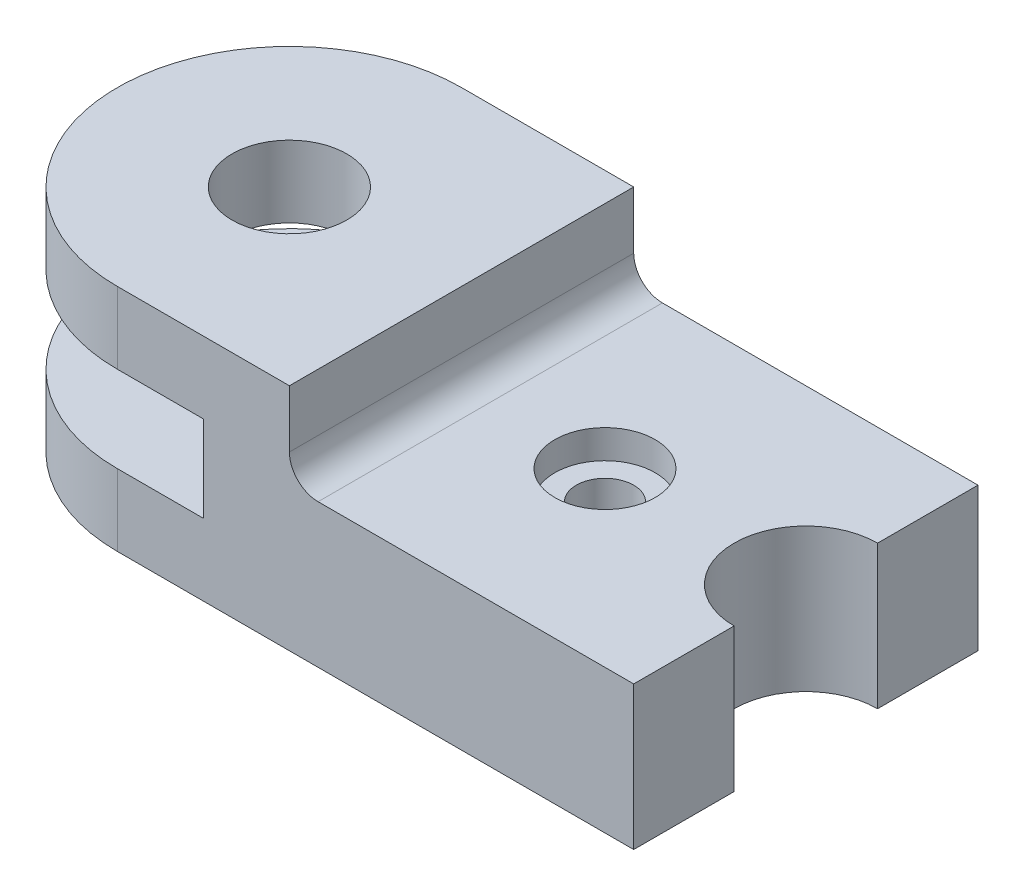
ISO-10303-21;
HEADER;
FILE_DESCRIPTION(('STEP AP214'),'2;1');
FILE_NAME('part.step','',(''),(''),'','','');
FILE_SCHEMA(('AUTOMOTIVE_DESIGN { 1 0 10303 214 1 1 1 1 }'));
ENDSEC;
DATA;
#1=APPLICATION_CONTEXT('core data for automotive mechanical design processes');
#2=APPLICATION_PROTOCOL_DEFINITION('international standard','automotive_design',2000,#1);
#3=PRODUCT_CONTEXT('',#1,'mechanical');
#4=PRODUCT('Part','Part','',(#3));
#5=PRODUCT_RELATED_PRODUCT_CATEGORY('part','',(#4));
#6=PRODUCT_DEFINITION_FORMATION('','',#4);
#7=PRODUCT_DEFINITION_CONTEXT('part definition',#1,'design');
#8=PRODUCT_DEFINITION('design','',#6,#7);
#9=PRODUCT_DEFINITION_SHAPE('','',#8);
#10=(LENGTH_UNIT() NAMED_UNIT(*) SI_UNIT(.MILLI.,.METRE.));
#11=(NAMED_UNIT(*) PLANE_ANGLE_UNIT() SI_UNIT($,.RADIAN.));
#12=(NAMED_UNIT(*) SI_UNIT($,.STERADIAN.) SOLID_ANGLE_UNIT());
#13=UNCERTAINTY_MEASURE_WITH_UNIT(LENGTH_MEASURE(1.E-05),#10,'distance_accuracy_value','');
#14=(GEOMETRIC_REPRESENTATION_CONTEXT(3) GLOBAL_UNCERTAINTY_ASSIGNED_CONTEXT((#13)) GLOBAL_UNIT_ASSIGNED_CONTEXT((#10,
#11,#12)) REPRESENTATION_CONTEXT('',''));
#15=CARTESIAN_POINT('',(0.,0.,0.));
#16=DIRECTION('',(0.,0.,1.));
#17=DIRECTION('',(1.,0.,0.));
#18=AXIS2_PLACEMENT_3D('',#15,#16,#17);
#19=CARTESIAN_POINT('',(69.85,0.,0.));
#20=DIRECTION('',(0.,1.,0.));
#21=DIRECTION('',(0.,0.,1.));
#22=AXIS2_PLACEMENT_3D('',#19,#20,#21);
#23=CYLINDRICAL_SURFACE('',#22,6.35);
#24=CARTESIAN_POINT('',(69.85,0.,0.));
#25=DIRECTION('',(0.,1.,0.));
#26=DIRECTION('',(0.,0.,1.));
#27=AXIS2_PLACEMENT_3D('',#24,#25,#26);
#28=CIRCLE('',#27,6.35);
#29=CARTESIAN_POINT('',(69.85,0.,6.34999999999998));
#30=VERTEX_POINT('',#29);
#31=EDGE_CURVE('E160',#30,#30,#28,.T.);
#32=ORIENTED_EDGE('',*,*,#31,.F.);
#33=EDGE_LOOP('',(#32));
#34=FACE_BOUND('',#33,.T.);
#35=CARTESIAN_POINT('',(69.85,25.4,0.));
#36=DIRECTION('',(0.,1.,0.));
#37=DIRECTION('',(0.,0.,1.));
#38=AXIS2_PLACEMENT_3D('',#35,#36,#37);
#39=CIRCLE('',#38,6.35);
#40=CARTESIAN_POINT('',(69.85,25.4,6.34999999999998));
#41=VERTEX_POINT('',#40);
#42=EDGE_CURVE('E53',#41,#41,#39,.F.);
#43=ORIENTED_EDGE('',*,*,#42,.F.);
#44=EDGE_LOOP('',(#43));
#45=FACE_BOUND('',#44,.T.);
#46=ADVANCED_FACE('F49',(#34,#45),#23,.F.);
#47=CARTESIAN_POINT('',(114.3,50.8,38.1));
#48=DIRECTION('',(-1.,0.,0.));
#49=DIRECTION('',(0.,0.,1.));
#50=AXIS2_PLACEMENT_3D('',#47,#48,#49);
#51=PLANE('',#50);
#52=DIRECTION('',(0.,0.,-1.));
#53=VECTOR('',#52,1.);
#54=CARTESIAN_POINT('',(114.3,0.,38.1));
#55=LINE('',#54,#53);
#56=CARTESIAN_POINT('',(114.3,0.,38.1));
#57=VERTEX_POINT('',#56);
#58=CARTESIAN_POINT('',(114.3,0.,15.875));
#59=VERTEX_POINT('',#58);
#60=EDGE_CURVE('E157',#57,#59,#55,.T.);
#61=ORIENTED_EDGE('',*,*,#60,.T.);
#62=DIRECTION('',(0.,1.,0.));
#63=VECTOR('',#62,1.);
#64=CARTESIAN_POINT('',(114.3,0.,15.875));
#65=LINE('',#64,#63);
#66=CARTESIAN_POINT('',(114.3,31.75,15.875));
#67=VERTEX_POINT('',#66);
#68=EDGE_CURVE('E142',#59,#67,#65,.T.);
#69=ORIENTED_EDGE('',*,*,#68,.T.);
#70=DIRECTION('',(0.,0.,-1.));
#71=VECTOR('',#70,1.);
#72=CARTESIAN_POINT('',(114.3,31.75,260.35));
#73=LINE('',#72,#71);
#74=CARTESIAN_POINT('',(114.3,31.75,38.1));
#75=VERTEX_POINT('',#74);
#76=EDGE_CURVE('E241',#75,#67,#73,.T.);
#77=ORIENTED_EDGE('',*,*,#76,.F.);
#78=DIRECTION('',(0.,-1.,0.));
#79=VECTOR('',#78,1.);
#80=CARTESIAN_POINT('',(114.3,50.8,38.1));
#81=LINE('',#80,#79);
#82=EDGE_CURVE('E164',#75,#57,#81,.T.);
#83=ORIENTED_EDGE('',*,*,#82,.T.);
#84=EDGE_LOOP('',(#61,#69,#77,#83));
#85=FACE_BOUND('',#84,.T.);
#86=ADVANCED_FACE('F162',(#85),#51,.F.);
#87=CARTESIAN_POINT('',(0.,50.8,38.1));
#88=DIRECTION('',(0.,0.,-1.));
#89=DIRECTION('',(-1.,0.,0.));
#90=AXIS2_PLACEMENT_3D('',#87,#88,#89);
#91=PLANE('',#90);
#92=DIRECTION('',(-1.,0.,0.));
#93=VECTOR('',#92,1.);
#94=CARTESIAN_POINT('',(0.,15.875,38.1));
#95=LINE('',#94,#93);
#96=CARTESIAN_POINT('',(19.05,15.875,38.1));
#97=VERTEX_POINT('',#96);
#98=CARTESIAN_POINT('',(0.,15.875,38.1));
#99=VERTEX_POINT('',#98);
#100=EDGE_CURVE('E225',#97,#99,#95,.T.);
#101=ORIENTED_EDGE('',*,*,#100,.T.);
#102=DIRECTION('',(0.,-1.,0.));
#103=VECTOR('',#102,1.);
#104=CARTESIAN_POINT('',(0.,50.8,38.1));
#105=LINE('',#104,#103);
#106=CARTESIAN_POINT('',(0.,0.,38.1));
#107=VERTEX_POINT('',#106);
#108=EDGE_CURVE('E183',#99,#107,#105,.T.);
#109=ORIENTED_EDGE('',*,*,#108,.T.);
#110=DIRECTION('',(1.,0.,0.));
#111=VECTOR('',#110,1.);
#112=CARTESIAN_POINT('',(0.,0.,38.1));
#113=LINE('',#112,#111);
#114=EDGE_CURVE('E171',#107,#57,#113,.T.);
#115=ORIENTED_EDGE('',*,*,#114,.T.);
#116=ORIENTED_EDGE('',*,*,#82,.F.);
#117=DIRECTION('',(1.,0.,0.));
#118=VECTOR('',#117,1.);
#119=CARTESIAN_POINT('',(0.,31.75,38.1));
#120=LINE('',#119,#118);
#121=CARTESIAN_POINT('',(44.45,31.75,38.1));
#122=VERTEX_POINT('',#121);
#123=EDGE_CURVE('E248',#122,#75,#120,.T.);
#124=ORIENTED_EDGE('',*,*,#123,.F.);
#125=CARTESIAN_POINT('',(44.45,38.1,38.1));
#126=DIRECTION('',(0.,0.,-1.));
#127=DIRECTION('',(-1.,0.,0.));
#128=AXIS2_PLACEMENT_3D('',#125,#126,#127);
#129=CIRCLE('',#128,6.35);
#130=CARTESIAN_POINT('',(38.1,38.1,38.1));
#131=VERTEX_POINT('',#130);
#132=EDGE_CURVE('E200',#122,#131,#129,.T.);
#133=ORIENTED_EDGE('',*,*,#132,.T.);
#134=DIRECTION('',(0.,-1.,0.));
#135=VECTOR('',#134,1.);
#136=CARTESIAN_POINT('',(38.1,50.8,38.1));
#137=LINE('',#136,#135);
#138=CARTESIAN_POINT('',(38.1,50.8,38.1));
#139=VERTEX_POINT('',#138);
#140=EDGE_CURVE('E245',#139,#131,#137,.T.);
#141=ORIENTED_EDGE('',*,*,#140,.F.);
#142=DIRECTION('',(1.,0.,0.));
#143=VECTOR('',#142,1.);
#144=CARTESIAN_POINT('',(0.,50.8,38.1));
#145=LINE('',#144,#143);
#146=CARTESIAN_POINT('',(0.,50.8,38.1));
#147=VERTEX_POINT('',#146);
#148=EDGE_CURVE('E253',#147,#139,#145,.T.);
#149=ORIENTED_EDGE('',*,*,#148,.F.);
#150=CARTESIAN_POINT('',(0.,34.925,38.1));
#151=VERTEX_POINT('',#150);
#152=EDGE_CURVE('E184',#147,#151,#105,.T.);
#153=ORIENTED_EDGE('',*,*,#152,.T.);
#154=DIRECTION('',(-1.,0.,0.));
#155=VECTOR('',#154,1.);
#156=CARTESIAN_POINT('',(0.,34.925,38.1));
#157=LINE('',#156,#155);
#158=CARTESIAN_POINT('',(19.05,34.925,38.1));
#159=VERTEX_POINT('',#158);
#160=EDGE_CURVE('E72',#159,#151,#157,.T.);
#161=ORIENTED_EDGE('',*,*,#160,.F.);
#162=DIRECTION('',(0.,-1.,0.));
#163=VECTOR('',#162,1.);
#164=CARTESIAN_POINT('',(19.05,0.,38.1));
#165=LINE('',#164,#163);
#166=EDGE_CURVE('E212',#159,#97,#165,.T.);
#167=ORIENTED_EDGE('',*,*,#166,.T.);
#168=EDGE_LOOP('',(#101,#109,#115,#116,#124,#133,#141,#149,#153,#161,#167));
#169=FACE_BOUND('',#168,.T.);
#170=ADVANCED_FACE('F262',(#169),#91,.F.);
#171=CARTESIAN_POINT('',(114.3,50.8,-38.1));
#172=DIRECTION('',(0.,0.,1.));
#173=DIRECTION('',(1.,0.,0.));
#174=AXIS2_PLACEMENT_3D('',#171,#172,#173);
#175=PLANE('',#174);
#176=DIRECTION('',(-1.,0.,0.));
#177=VECTOR('',#176,1.);
#178=CARTESIAN_POINT('',(0.,15.875,-38.1));
#179=LINE('',#178,#177);
#180=CARTESIAN_POINT('',(19.05,15.875,-38.1));
#181=VERTEX_POINT('',#180);
#182=CARTESIAN_POINT('',(0.,15.875,-38.1));
#183=VERTEX_POINT('',#182);
#184=EDGE_CURVE('E228',#181,#183,#179,.T.);
#185=ORIENTED_EDGE('',*,*,#184,.F.);
#186=DIRECTION('',(0.,-1.,0.));
#187=VECTOR('',#186,1.);
#188=CARTESIAN_POINT('',(19.05,0.,-38.1));
#189=LINE('',#188,#187);
#190=CARTESIAN_POINT('',(19.05,34.925,-38.1));
#191=VERTEX_POINT('',#190);
#192=EDGE_CURVE('E222',#191,#181,#189,.T.);
#193=ORIENTED_EDGE('',*,*,#192,.F.);
#194=DIRECTION('',(-1.,0.,0.));
#195=VECTOR('',#194,1.);
#196=CARTESIAN_POINT('',(0.,34.925,-38.1));
#197=LINE('',#196,#195);
#198=CARTESIAN_POINT('',(0.,34.925,-38.1));
#199=VERTEX_POINT('',#198);
#200=EDGE_CURVE('E224',#191,#199,#197,.T.);
#201=ORIENTED_EDGE('',*,*,#200,.T.);
#202=DIRECTION('',(0.,-1.,0.));
#203=VECTOR('',#202,1.);
#204=CARTESIAN_POINT('',(0.,50.8,-38.1));
#205=LINE('',#204,#203);
#206=CARTESIAN_POINT('',(0.,50.8,-38.1));
#207=VERTEX_POINT('',#206);
#208=EDGE_CURVE('E175',#207,#199,#205,.T.);
#209=ORIENTED_EDGE('',*,*,#208,.F.);
#210=DIRECTION('',(-1.,0.,0.));
#211=VECTOR('',#210,1.);
#212=CARTESIAN_POINT('',(114.3,50.8,-38.1));
#213=LINE('',#212,#211);
#214=CARTESIAN_POINT('',(38.1,50.8,-38.1));
#215=VERTEX_POINT('',#214);
#216=EDGE_CURVE('E256',#215,#207,#213,.T.);
#217=ORIENTED_EDGE('',*,*,#216,.F.);
#218=DIRECTION('',(0.,1.,0.));
#219=VECTOR('',#218,1.);
#220=CARTESIAN_POINT('',(38.1,50.8,-38.1));
#221=LINE('',#220,#219);
#222=CARTESIAN_POINT('',(38.1,38.1,-38.1));
#223=VERTEX_POINT('',#222);
#224=EDGE_CURVE('E243',#223,#215,#221,.T.);
#225=ORIENTED_EDGE('',*,*,#224,.F.);
#226=CARTESIAN_POINT('',(44.45,38.1,-38.1));
#227=DIRECTION('',(0.,0.,1.));
#228=DIRECTION('',(1.,0.,0.));
#229=AXIS2_PLACEMENT_3D('',#226,#227,#228);
#230=CIRCLE('',#229,6.35);
#231=CARTESIAN_POINT('',(44.45,31.75,-38.1));
#232=VERTEX_POINT('',#231);
#233=EDGE_CURVE('E198',#223,#232,#230,.T.);
#234=ORIENTED_EDGE('',*,*,#233,.T.);
#235=DIRECTION('',(-1.,0.,0.));
#236=VECTOR('',#235,1.);
#237=CARTESIAN_POINT('',(114.3,31.75,-38.1));
#238=LINE('',#237,#236);
#239=CARTESIAN_POINT('',(114.3,31.75,-38.1));
#240=VERTEX_POINT('',#239);
#241=EDGE_CURVE('E190',#240,#232,#238,.T.);
#242=ORIENTED_EDGE('',*,*,#241,.F.);
#243=DIRECTION('',(0.,-1.,0.));
#244=VECTOR('',#243,1.);
#245=CARTESIAN_POINT('',(114.3,50.8,-38.1));
#246=LINE('',#245,#244);
#247=CARTESIAN_POINT('',(114.3,0.,-38.1));
#248=VERTEX_POINT('',#247);
#249=EDGE_CURVE('E178',#240,#248,#246,.T.);
#250=ORIENTED_EDGE('',*,*,#249,.T.);
#251=DIRECTION('',(-1.,0.,0.));
#252=VECTOR('',#251,1.);
#253=CARTESIAN_POINT('',(114.3,0.,-38.1));
#254=LINE('',#253,#252);
#255=CARTESIAN_POINT('',(0.,0.,-38.1));
#256=VERTEX_POINT('',#255);
#257=EDGE_CURVE('E166',#248,#256,#254,.T.);
#258=ORIENTED_EDGE('',*,*,#257,.T.);
#259=EDGE_CURVE('E179',#183,#256,#205,.T.);
#260=ORIENTED_EDGE('',*,*,#259,.F.);
#261=EDGE_LOOP('',(#185,#193,#201,#209,#217,#225,#234,#242,#250,#258,#260));
#262=FACE_BOUND('',#261,.T.);
#263=ADVANCED_FACE('F267',(#262),#175,.F.);
#264=CARTESIAN_POINT('',(0.,50.8,0.));
#265=DIRECTION('',(0.,-1.,0.));
#266=DIRECTION('',(0.,0.,-1.));
#267=AXIS2_PLACEMENT_3D('',#264,#265,#266);
#268=CYLINDRICAL_SURFACE('',#267,38.1);
#269=CARTESIAN_POINT('',(0.,15.875,0.));
#270=DIRECTION('',(0.,1.,0.));
#271=DIRECTION('',(-1.,0.,0.));
#272=AXIS2_PLACEMENT_3D('',#269,#270,#271);
#273=CIRCLE('',#272,38.1);
#274=EDGE_CURVE('E58',#183,#99,#273,.T.);
#275=ORIENTED_EDGE('',*,*,#274,.F.);
#276=ORIENTED_EDGE('',*,*,#259,.T.);
#277=CARTESIAN_POINT('',(0.,0.,0.));
#278=DIRECTION('',(0.,1.,0.));
#279=DIRECTION('',(0.,0.,1.));
#280=AXIS2_PLACEMENT_3D('',#277,#278,#279);
#281=CIRCLE('',#280,38.1);
#282=EDGE_CURVE('E250',#256,#107,#281,.T.);
#283=ORIENTED_EDGE('',*,*,#282,.T.);
#284=ORIENTED_EDGE('',*,*,#108,.F.);
#285=EDGE_LOOP('',(#275,#276,#283,#284));
#286=FACE_BOUND('',#285,.T.);
#287=ADVANCED_FACE('F332',(#286),#268,.T.);
#288=CARTESIAN_POINT('',(114.3,31.75,-15.875));
#289=VERTEX_POINT('',#288);
#290=EDGE_CURVE('E239',#289,#240,#73,.T.);
#291=ORIENTED_EDGE('',*,*,#290,.F.);
#292=DIRECTION('',(0.,1.,0.));
#293=VECTOR('',#292,1.);
#294=CARTESIAN_POINT('',(114.3,0.,-15.875));
#295=LINE('',#294,#293);
#296=CARTESIAN_POINT('',(114.3,0.,-15.875));
#297=VERTEX_POINT('',#296);
#298=EDGE_CURVE('E64',#289,#297,#295,.F.);
#299=ORIENTED_EDGE('',*,*,#298,.T.);
#300=EDGE_CURVE('E159',#297,#248,#55,.T.);
#301=ORIENTED_EDGE('',*,*,#300,.T.);
#302=ORIENTED_EDGE('',*,*,#249,.F.);
#303=EDGE_LOOP('',(#291,#299,#301,#302));
#304=FACE_BOUND('',#303,.T.);
#305=ADVANCED_FACE('F272',(#304),#51,.F.);
#306=CARTESIAN_POINT('',(0.,50.8,0.));
#307=DIRECTION('',(0.,1.,0.));
#308=DIRECTION('',(0.,0.,1.));
#309=AXIS2_PLACEMENT_3D('',#306,#307,#308);
#310=PLANE('',#309);
#311=CARTESIAN_POINT('',(0.,50.8,0.));
#312=DIRECTION('',(0.,1.,0.));
#313=DIRECTION('',(0.,0.,1.));
#314=AXIS2_PLACEMENT_3D('',#311,#312,#313);
#315=CIRCLE('',#314,12.7);
#316=CARTESIAN_POINT('',(0.,50.8,12.7));
#317=VERTEX_POINT('',#316);
#318=EDGE_CURVE('E150',#317,#317,#315,.T.);
#319=ORIENTED_EDGE('',*,*,#318,.F.);
#320=EDGE_LOOP('',(#319));
#321=FACE_BOUND('',#320,.T.);
#322=ORIENTED_EDGE('',*,*,#148,.T.);
#323=DIRECTION('',(0.,0.,-1.));
#324=VECTOR('',#323,1.);
#325=CARTESIAN_POINT('',(38.1,50.8,0.));
#326=LINE('',#325,#324);
#327=EDGE_CURVE('E187',#139,#215,#326,.T.);
#328=ORIENTED_EDGE('',*,*,#327,.T.);
#329=ORIENTED_EDGE('',*,*,#216,.T.);
#330=CARTESIAN_POINT('',(0.,50.8,0.));
#331=DIRECTION('',(0.,1.,0.));
#332=DIRECTION('',(0.,0.,1.));
#333=AXIS2_PLACEMENT_3D('',#330,#331,#332);
#334=CIRCLE('',#333,38.1);
#335=EDGE_CURVE('E169',#207,#147,#334,.T.);
#336=ORIENTED_EDGE('',*,*,#335,.T.);
#337=EDGE_LOOP('',(#322,#328,#329,#336));
#338=FACE_BOUND('',#337,.T.);
#339=ADVANCED_FACE('F323',(#321,#338),#310,.T.);
#340=ORIENTED_EDGE('',*,*,#208,.T.);
#341=CARTESIAN_POINT('',(0.,34.925,0.));
#342=DIRECTION('',(0.,1.,0.));
#343=DIRECTION('',(0.,0.,1.));
#344=AXIS2_PLACEMENT_3D('',#341,#342,#343);
#345=CIRCLE('',#344,38.1);
#346=EDGE_CURVE('E202',#199,#151,#345,.T.);
#347=ORIENTED_EDGE('',*,*,#346,.T.);
#348=ORIENTED_EDGE('',*,*,#152,.F.);
#349=ORIENTED_EDGE('',*,*,#335,.F.);
#350=EDGE_LOOP('',(#340,#347,#348,#349));
#351=FACE_BOUND('',#350,.T.);
#352=ADVANCED_FACE('F326',(#351),#268,.T.);
#353=CARTESIAN_POINT('',(0.,0.,0.));
#354=DIRECTION('',(0.,1.,0.));
#355=DIRECTION('',(0.,0.,1.));
#356=AXIS2_PLACEMENT_3D('',#353,#354,#355);
#357=PLANE('',#356);
#358=ORIENTED_EDGE('',*,*,#31,.T.);
#359=EDGE_LOOP('',(#358));
#360=FACE_BOUND('',#359,.T.);
#361=CARTESIAN_POINT('',(0.,0.,0.));
#362=DIRECTION('',(0.,1.,0.));
#363=DIRECTION('',(0.,0.,1.));
#364=AXIS2_PLACEMENT_3D('',#361,#362,#363);
#365=CIRCLE('',#364,12.7);
#366=CARTESIAN_POINT('',(0.,0.,12.7));
#367=VERTEX_POINT('',#366);
#368=EDGE_CURVE('E208',#367,#367,#365,.T.);
#369=ORIENTED_EDGE('',*,*,#368,.T.);
#370=EDGE_LOOP('',(#369));
#371=FACE_BOUND('',#370,.T.);
#372=ORIENTED_EDGE('',*,*,#300,.F.);
#373=CARTESIAN_POINT('',(114.3,0.,0.));
#374=DIRECTION('',(0.,1.,0.));
#375=DIRECTION('',(0.,0.,1.));
#376=AXIS2_PLACEMENT_3D('',#373,#374,#375);
#377=CIRCLE('',#376,15.875);
#378=EDGE_CURVE('E145',#297,#59,#377,.T.);
#379=ORIENTED_EDGE('',*,*,#378,.T.);
#380=ORIENTED_EDGE('',*,*,#60,.F.);
#381=ORIENTED_EDGE('',*,*,#114,.F.);
#382=ORIENTED_EDGE('',*,*,#282,.F.);
#383=ORIENTED_EDGE('',*,*,#257,.F.);
#384=EDGE_LOOP('',(#372,#379,#380,#381,#382,#383));
#385=FACE_BOUND('',#384,.T.);
#386=ADVANCED_FACE('F155',(#360,#371,#385),#357,.F.);
#387=CARTESIAN_POINT('',(38.1,31.75,260.35));
#388=DIRECTION('',(0.,1.,0.));
#389=DIRECTION('',(0.,0.,1.));
#390=AXIS2_PLACEMENT_3D('',#387,#388,#389);
#391=PLANE('',#390);
#392=CARTESIAN_POINT('',(69.85,31.75,0.));
#393=DIRECTION('',(0.,1.,0.));
#394=DIRECTION('',(0.,0.,1.));
#395=AXIS2_PLACEMENT_3D('',#392,#393,#394);
#396=CIRCLE('',#395,11.1125);
#397=CARTESIAN_POINT('',(69.85,31.75,11.1125));
#398=VERTEX_POINT('',#397);
#399=EDGE_CURVE('E276',#398,#398,#396,.T.);
#400=ORIENTED_EDGE('',*,*,#399,.F.);
#401=EDGE_LOOP('',(#400));
#402=FACE_BOUND('',#401,.T.);
#403=CARTESIAN_POINT('',(114.3,31.75,0.));
#404=DIRECTION('',(0.,1.,0.));
#405=DIRECTION('',(0.,0.,1.));
#406=AXIS2_PLACEMENT_3D('',#403,#404,#405);
#407=CIRCLE('',#406,15.875);
#408=EDGE_CURVE('E13',#289,#67,#407,.T.);
#409=ORIENTED_EDGE('',*,*,#408,.F.);
#410=ORIENTED_EDGE('',*,*,#290,.T.);
#411=ORIENTED_EDGE('',*,*,#241,.T.);
#412=DIRECTION('',(0.,0.,-1.));
#413=VECTOR('',#412,1.);
#414=CARTESIAN_POINT('',(44.45,31.75,38.1));
#415=LINE('',#414,#413);
#416=EDGE_CURVE('E196',#232,#122,#415,.F.);
#417=ORIENTED_EDGE('',*,*,#416,.T.);
#418=ORIENTED_EDGE('',*,*,#123,.T.);
#419=ORIENTED_EDGE('',*,*,#76,.T.);
#420=EDGE_LOOP('',(#409,#410,#411,#417,#418,#419));
#421=FACE_BOUND('',#420,.T.);
#422=ADVANCED_FACE('F315',(#402,#421),#391,.T.);
#423=CARTESIAN_POINT('',(38.1,50.8,260.35));
#424=DIRECTION('',(1.,0.,0.));
#425=DIRECTION('',(0.,0.,-1.));
#426=AXIS2_PLACEMENT_3D('',#423,#424,#425);
#427=PLANE('',#426);
#428=ORIENTED_EDGE('',*,*,#140,.T.);
#429=DIRECTION('',(0.,0.,-1.));
#430=VECTOR('',#429,1.);
#431=CARTESIAN_POINT('',(38.1,38.1,-38.1));
#432=LINE('',#431,#430);
#433=EDGE_CURVE('E193',#131,#223,#432,.T.);
#434=ORIENTED_EDGE('',*,*,#433,.T.);
#435=ORIENTED_EDGE('',*,*,#224,.T.);
#436=ORIENTED_EDGE('',*,*,#327,.F.);
#437=EDGE_LOOP('',(#428,#434,#435,#436));
#438=FACE_BOUND('',#437,.T.);
#439=ADVANCED_FACE('F318',(#438),#427,.T.);
#440=CARTESIAN_POINT('',(44.45,38.1,260.35));
#441=DIRECTION('',(0.,0.,1.));
#442=DIRECTION('',(1.,0.,0.));
#443=AXIS2_PLACEMENT_3D('',#440,#441,#442);
#444=CYLINDRICAL_SURFACE('',#443,6.35);
#445=ORIENTED_EDGE('',*,*,#132,.F.);
#446=ORIENTED_EDGE('',*,*,#416,.F.);
#447=ORIENTED_EDGE('',*,*,#233,.F.);
#448=ORIENTED_EDGE('',*,*,#433,.F.);
#449=EDGE_LOOP('',(#445,#446,#447,#448));
#450=FACE_BOUND('',#449,.T.);
#451=ADVANCED_FACE('F51',(#450),#444,.F.);
#452=CARTESIAN_POINT('',(0.,15.875,-38.1));
#453=DIRECTION('',(0.,1.,0.));
#454=DIRECTION('',(-1.,0.,0.));
#455=AXIS2_PLACEMENT_3D('',#452,#453,#454);
#456=PLANE('',#455);
#457=CARTESIAN_POINT('',(0.,15.875,0.));
#458=DIRECTION('',(0.,1.,0.));
#459=DIRECTION('',(-1.,0.,0.));
#460=AXIS2_PLACEMENT_3D('',#457,#458,#459);
#461=CIRCLE('',#460,12.7);
#462=CARTESIAN_POINT('',(-12.7,15.875,0.));
#463=VERTEX_POINT('',#462);
#464=EDGE_CURVE('E207',#463,#463,#461,.T.);
#465=ORIENTED_EDGE('',*,*,#464,.F.);
#466=EDGE_LOOP('',(#465));
#467=FACE_BOUND('',#466,.T.);
#468=ORIENTED_EDGE('',*,*,#274,.T.);
#469=ORIENTED_EDGE('',*,*,#100,.F.);
#470=DIRECTION('',(0.,0.,1.));
#471=VECTOR('',#470,1.);
#472=CARTESIAN_POINT('',(19.05,15.875,-38.1));
#473=LINE('',#472,#471);
#474=EDGE_CURVE('E236',#181,#97,#473,.T.);
#475=ORIENTED_EDGE('',*,*,#474,.F.);
#476=ORIENTED_EDGE('',*,*,#184,.T.);
#477=EDGE_LOOP('',(#468,#469,#475,#476));
#478=FACE_BOUND('',#477,.T.);
#479=ADVANCED_FACE('F304',(#467,#478),#456,.T.);
#480=CARTESIAN_POINT('',(0.,34.925,-38.1));
#481=DIRECTION('',(0.,1.,0.));
#482=DIRECTION('',(0.,0.,1.));
#483=AXIS2_PLACEMENT_3D('',#480,#481,#482);
#484=PLANE('',#483);
#485=CARTESIAN_POINT('',(0.,34.925,0.));
#486=DIRECTION('',(0.,1.,0.));
#487=DIRECTION('',(0.,0.,1.));
#488=AXIS2_PLACEMENT_3D('',#485,#486,#487);
#489=CIRCLE('',#488,12.7);
#490=CARTESIAN_POINT('',(0.,34.925,12.7));
#491=VERTEX_POINT('',#490);
#492=EDGE_CURVE('E205',#491,#491,#489,.T.);
#493=ORIENTED_EDGE('',*,*,#492,.T.);
#494=EDGE_LOOP('',(#493));
#495=FACE_BOUND('',#494,.T.);
#496=ORIENTED_EDGE('',*,*,#200,.F.);
#497=DIRECTION('',(0.,0.,1.));
#498=VECTOR('',#497,1.);
#499=CARTESIAN_POINT('',(19.05,34.925,-38.1));
#500=LINE('',#499,#498);
#501=EDGE_CURVE('E230',#191,#159,#500,.T.);
#502=ORIENTED_EDGE('',*,*,#501,.T.);
#503=ORIENTED_EDGE('',*,*,#160,.T.);
#504=ORIENTED_EDGE('',*,*,#346,.F.);
#505=EDGE_LOOP('',(#496,#502,#503,#504));
#506=FACE_BOUND('',#505,.T.);
#507=ADVANCED_FACE('F307',(#495,#506),#484,.F.);
#508=CARTESIAN_POINT('',(19.05,0.,-38.1));
#509=DIRECTION('',(-1.,0.,0.));
#510=DIRECTION('',(0.,0.,1.));
#511=AXIS2_PLACEMENT_3D('',#508,#509,#510);
#512=PLANE('',#511);
#513=ORIENTED_EDGE('',*,*,#166,.F.);
#514=ORIENTED_EDGE('',*,*,#501,.F.);
#515=ORIENTED_EDGE('',*,*,#192,.T.);
#516=ORIENTED_EDGE('',*,*,#474,.T.);
#517=EDGE_LOOP('',(#513,#514,#515,#516));
#518=FACE_BOUND('',#517,.T.);
#519=ADVANCED_FACE('F311',(#518),#512,.T.);
#520=CARTESIAN_POINT('',(0.,0.,0.));
#521=DIRECTION('',(0.,1.,0.));
#522=DIRECTION('',(0.,0.,1.));
#523=AXIS2_PLACEMENT_3D('',#520,#521,#522);
#524=CYLINDRICAL_SURFACE('',#523,12.7);
#525=ORIENTED_EDGE('',*,*,#318,.T.);
#526=EDGE_LOOP('',(#525));
#527=FACE_BOUND('',#526,.T.);
#528=ORIENTED_EDGE('',*,*,#492,.F.);
#529=EDGE_LOOP('',(#528));
#530=FACE_BOUND('',#529,.T.);
#531=ADVANCED_FACE('F302',(#527,#530),#524,.F.);
#532=ORIENTED_EDGE('',*,*,#464,.T.);
#533=EDGE_LOOP('',(#532));
#534=FACE_BOUND('',#533,.T.);
#535=ORIENTED_EDGE('',*,*,#368,.F.);
#536=EDGE_LOOP('',(#535));
#537=FACE_BOUND('',#536,.T.);
#538=ADVANCED_FACE('F299',(#534,#537),#524,.F.);
#539=CARTESIAN_POINT('',(114.3,0.,0.));
#540=DIRECTION('',(0.,1.,0.));
#541=DIRECTION('',(0.,0.,1.));
#542=AXIS2_PLACEMENT_3D('',#539,#540,#541);
#543=CYLINDRICAL_SURFACE('',#542,15.875);
#544=ORIENTED_EDGE('',*,*,#378,.F.);
#545=ORIENTED_EDGE('',*,*,#298,.F.);
#546=ORIENTED_EDGE('',*,*,#408,.T.);
#547=ORIENTED_EDGE('',*,*,#68,.F.);
#548=EDGE_LOOP('',(#544,#545,#546,#547));
#549=FACE_BOUND('',#548,.T.);
#550=ADVANCED_FACE('F144',(#549),#543,.F.);
#551=CARTESIAN_POINT('',(69.85,25.4,0.));
#552=DIRECTION('',(0.,1.,0.));
#553=DIRECTION('',(0.,0.,1.));
#554=AXIS2_PLACEMENT_3D('',#551,#552,#553);
#555=PLANE('',#554);
#556=CARTESIAN_POINT('',(69.85,25.4,0.));
#557=DIRECTION('',(0.,1.,0.));
#558=DIRECTION('',(0.,0.,1.));
#559=AXIS2_PLACEMENT_3D('',#556,#557,#558);
#560=CIRCLE('',#559,11.1125);
#561=CARTESIAN_POINT('',(69.85,25.4,11.1125));
#562=VERTEX_POINT('',#561);
#563=EDGE_CURVE('E279',#562,#562,#560,.T.);
#564=ORIENTED_EDGE('',*,*,#563,.T.);
#565=EDGE_LOOP('',(#564));
#566=FACE_BOUND('',#565,.T.);
#567=ORIENTED_EDGE('',*,*,#42,.T.);
#568=EDGE_LOOP('',(#567));
#569=FACE_BOUND('',#568,.T.);
#570=ADVANCED_FACE('F286',(#566,#569),#555,.T.);
#571=CARTESIAN_POINT('',(69.85,25.4,0.));
#572=DIRECTION('',(0.,1.,0.));
#573=DIRECTION('',(0.,0.,1.));
#574=AXIS2_PLACEMENT_3D('',#571,#572,#573);
#575=CYLINDRICAL_SURFACE('',#574,11.1125);
#576=ORIENTED_EDGE('',*,*,#563,.F.);
#577=EDGE_LOOP('',(#576));
#578=FACE_BOUND('',#577,.T.);
#579=ORIENTED_EDGE('',*,*,#399,.T.);
#580=EDGE_LOOP('',(#579));
#581=FACE_BOUND('',#580,.T.);
#582=ADVANCED_FACE('F403',(#578,#581),#575,.F.);
#583=CLOSED_SHELL('',(#46,#86,#170,#263,#287,#305,#339,#352,#386,#422,#439,#451,#479,#507,#519,
#531,#538,#550,#570,#582));
#584=MANIFOLD_SOLID_BREP('B2',#583);
#585=ADVANCED_BREP_SHAPE_REPRESENTATION('',(#18,#584),#14);
#586=SHAPE_DEFINITION_REPRESENTATION(#9,#585);
ENDSEC;
END-ISO-10303-21;
